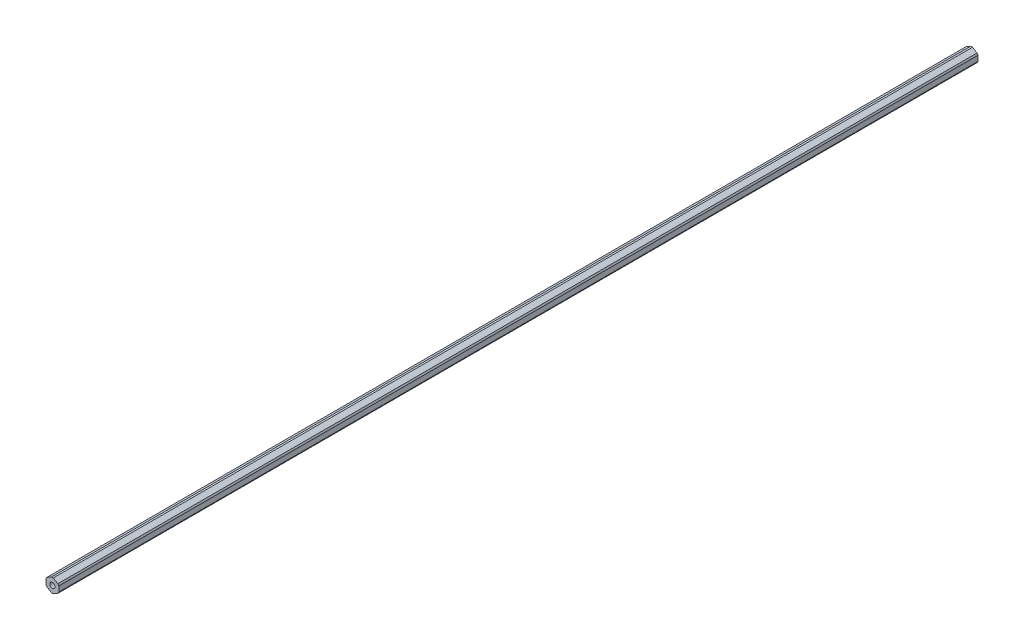
ISO-10303-21;
HEADER;
FILE_DESCRIPTION(('STEP AP214'),'2;1');
FILE_NAME('part.step','',(''),(''),'','','');
FILE_SCHEMA(('AUTOMOTIVE_DESIGN { 1 0 10303 214 1 1 1 1 }'));
ENDSEC;
DATA;
#1=APPLICATION_CONTEXT('core data for automotive mechanical design processes');
#2=APPLICATION_PROTOCOL_DEFINITION('international standard','automotive_design',2000,#1);
#3=PRODUCT_CONTEXT('',#1,'mechanical');
#4=PRODUCT('Part','Part','',(#3));
#5=PRODUCT_RELATED_PRODUCT_CATEGORY('part','',(#4));
#6=PRODUCT_DEFINITION_FORMATION('','',#4);
#7=PRODUCT_DEFINITION_CONTEXT('part definition',#1,'design');
#8=PRODUCT_DEFINITION('design','',#6,#7);
#9=PRODUCT_DEFINITION_SHAPE('','',#8);
#10=(LENGTH_UNIT() NAMED_UNIT(*) SI_UNIT(.MILLI.,.METRE.));
#11=(NAMED_UNIT(*) PLANE_ANGLE_UNIT() SI_UNIT($,.RADIAN.));
#12=(NAMED_UNIT(*) SI_UNIT($,.STERADIAN.) SOLID_ANGLE_UNIT());
#13=UNCERTAINTY_MEASURE_WITH_UNIT(LENGTH_MEASURE(1.E-05),#10,'distance_accuracy_value','');
#14=(GEOMETRIC_REPRESENTATION_CONTEXT(3) GLOBAL_UNCERTAINTY_ASSIGNED_CONTEXT((#13)) GLOBAL_UNIT_ASSIGNED_CONTEXT((#10,
#11,#12)) REPRESENTATION_CONTEXT('',''));
#15=CARTESIAN_POINT('',(0.,0.,0.));
#16=DIRECTION('',(0.,0.,1.));
#17=DIRECTION('',(1.,0.,0.));
#18=AXIS2_PLACEMENT_3D('',#15,#16,#17);
#19=CARTESIAN_POINT('',(6.35,3.66617420935413,914.4));
#20=DIRECTION('',(-0.5,-0.866025403784439,0.));
#21=DIRECTION('',(0.866025403784439,-0.5,0.));
#22=AXIS2_PLACEMENT_3D('',#19,#20,#21);
#23=PLANE('',#22);
#24=DIRECTION('',(0.,0.,-1.));
#25=VECTOR('',#24,1.);
#26=CARTESIAN_POINT('',(0.888411377865496,6.81942387054648,914.4));
#27=LINE('',#26,#25);
#28=CARTESIAN_POINT('',(0.88841137786549,6.81942387054648,914.4));
#29=VERTEX_POINT('',#28);
#30=CARTESIAN_POINT('',(0.88841137786549,6.81942387054648,0.));
#31=VERTEX_POINT('',#30);
#32=EDGE_CURVE('E161',#29,#31,#27,.T.);
#33=ORIENTED_EDGE('',*,*,#32,.F.);
#34=DIRECTION('',(-0.866025403784439,0.5,0.));
#35=VECTOR('',#34,1.);
#36=CARTESIAN_POINT('',(6.35,3.66617420935413,914.4));
#37=LINE('',#36,#35);
#38=CARTESIAN_POINT('',(5.46158862213451,4.17909875751589,914.4));
#39=VERTEX_POINT('',#38);
#40=EDGE_CURVE('E149',#39,#29,#37,.T.);
#41=ORIENTED_EDGE('',*,*,#40,.F.);
#42=DIRECTION('',(0.,0.,-1.));
#43=VECTOR('',#42,1.);
#44=CARTESIAN_POINT('',(5.46158862213451,4.1790987575159,914.4));
#45=LINE('',#44,#43);
#46=CARTESIAN_POINT('',(5.46158862213451,4.17909875751589,0.));
#47=VERTEX_POINT('',#46);
#48=EDGE_CURVE('E182',#47,#39,#45,.F.);
#49=ORIENTED_EDGE('',*,*,#48,.F.);
#50=DIRECTION('',(-0.866025403784439,0.5,0.));
#51=VECTOR('',#50,1.);
#52=CARTESIAN_POINT('',(6.35,3.66617420935413,0.));
#53=LINE('',#52,#51);
#54=EDGE_CURVE('E157',#47,#31,#53,.T.);
#55=ORIENTED_EDGE('',*,*,#54,.T.);
#56=EDGE_LOOP('',(#33,#41,#49,#55));
#57=FACE_BOUND('',#56,.T.);
#58=ADVANCED_FACE('F32',(#57),#23,.F.);
#59=CARTESIAN_POINT('',(0.,7.33234841870825,914.4));
#60=DIRECTION('',(0.5,-0.866025403784439,0.));
#61=DIRECTION('',(0.866025403784439,0.5,0.));
#62=AXIS2_PLACEMENT_3D('',#59,#60,#61);
#63=PLANE('',#62);
#64=DIRECTION('',(0.,0.,-1.));
#65=VECTOR('',#64,1.);
#66=CARTESIAN_POINT('',(-5.4615886221345,4.1790987575159,914.4));
#67=LINE('',#66,#65);
#68=CARTESIAN_POINT('',(-5.46158862213451,4.17909875751589,914.4));
#69=VERTEX_POINT('',#68);
#70=CARTESIAN_POINT('',(-5.46158862213451,4.17909875751589,0.));
#71=VERTEX_POINT('',#70);
#72=EDGE_CURVE('E47',#69,#71,#67,.T.);
#73=ORIENTED_EDGE('',*,*,#72,.F.);
#74=DIRECTION('',(-0.866025403784439,-0.5,0.));
#75=VECTOR('',#74,1.);
#76=CARTESIAN_POINT('',(0.,7.33234841870825,914.4));
#77=LINE('',#76,#75);
#78=CARTESIAN_POINT('',(-0.888411377865489,6.81942387054648,914.4));
#79=VERTEX_POINT('',#78);
#80=EDGE_CURVE('E138',#79,#69,#77,.T.);
#81=ORIENTED_EDGE('',*,*,#80,.F.);
#82=DIRECTION('',(0.,0.,-1.));
#83=VECTOR('',#82,1.);
#84=CARTESIAN_POINT('',(-0.888411377865495,6.81942387054648,914.4));
#85=LINE('',#84,#83);
#86=CARTESIAN_POINT('',(-0.888411377865489,6.81942387054648,0.));
#87=VERTEX_POINT('',#86);
#88=EDGE_CURVE('E185',#87,#79,#85,.F.);
#89=ORIENTED_EDGE('',*,*,#88,.F.);
#90=DIRECTION('',(-0.866025403784439,-0.5,0.));
#91=VECTOR('',#90,1.);
#92=CARTESIAN_POINT('',(0.,7.33234841870825,0.));
#93=LINE('',#92,#91);
#94=EDGE_CURVE('E160',#87,#71,#93,.T.);
#95=ORIENTED_EDGE('',*,*,#94,.T.);
#96=EDGE_LOOP('',(#73,#81,#89,#95));
#97=FACE_BOUND('',#96,.T.);
#98=ADVANCED_FACE('F266',(#97),#63,.F.);
#99=CARTESIAN_POINT('',(-6.35,3.66617420935412,914.4));
#100=DIRECTION('',(1.,0.,0.));
#101=DIRECTION('',(0.,0.,-1.));
#102=AXIS2_PLACEMENT_3D('',#99,#100,#101);
#103=PLANE('',#102);
#104=DIRECTION('',(0.,0.,-1.));
#105=VECTOR('',#104,1.);
#106=CARTESIAN_POINT('',(-6.35,-2.64032511303059,914.4));
#107=LINE('',#106,#105);
#108=CARTESIAN_POINT('',(-6.35,-2.64032511303059,914.4));
#109=VERTEX_POINT('',#108);
#110=CARTESIAN_POINT('',(-6.35,-2.64032511303059,0.));
#111=VERTEX_POINT('',#110);
#112=EDGE_CURVE('E55',#109,#111,#107,.T.);
#113=ORIENTED_EDGE('',*,*,#112,.F.);
#114=DIRECTION('',(0.,-1.,0.));
#115=VECTOR('',#114,1.);
#116=CARTESIAN_POINT('',(-6.35,3.66617420935412,914.4));
#117=LINE('',#116,#115);
#118=CARTESIAN_POINT('',(-6.35,2.64032511303059,914.4));
#119=VERTEX_POINT('',#118);
#120=EDGE_CURVE('E135',#119,#109,#117,.T.);
#121=ORIENTED_EDGE('',*,*,#120,.F.);
#122=DIRECTION('',(0.,0.,-1.));
#123=VECTOR('',#122,1.);
#124=CARTESIAN_POINT('',(-6.35,2.64032511303059,914.4));
#125=LINE('',#124,#123);
#126=CARTESIAN_POINT('',(-6.35,2.64032511303059,0.));
#127=VERTEX_POINT('',#126);
#128=EDGE_CURVE('E118',#127,#119,#125,.F.);
#129=ORIENTED_EDGE('',*,*,#128,.F.);
#130=DIRECTION('',(0.,-1.,0.));
#131=VECTOR('',#130,1.);
#132=CARTESIAN_POINT('',(-6.35,3.66617420935412,0.));
#133=LINE('',#132,#131);
#134=EDGE_CURVE('E164',#127,#111,#133,.T.);
#135=ORIENTED_EDGE('',*,*,#134,.T.);
#136=EDGE_LOOP('',(#113,#121,#129,#135));
#137=FACE_BOUND('',#136,.T.);
#138=ADVANCED_FACE('F143',(#137),#103,.F.);
#139=CARTESIAN_POINT('',(-6.35,-3.66617420935412,914.4));
#140=DIRECTION('',(0.5,0.866025403784439,0.));
#141=DIRECTION('',(-0.866025403784438,0.5,0.));
#142=AXIS2_PLACEMENT_3D('',#139,#140,#141);
#143=PLANE('',#142);
#144=DIRECTION('',(0.,0.,-1.));
#145=VECTOR('',#144,1.);
#146=CARTESIAN_POINT('',(-0.888411377865498,-6.81942387054648,914.4));
#147=LINE('',#146,#145);
#148=CARTESIAN_POINT('',(-0.888411377865492,-6.81942387054648,914.4));
#149=VERTEX_POINT('',#148);
#150=CARTESIAN_POINT('',(-0.888411377865492,-6.81942387054648,0.));
#151=VERTEX_POINT('',#150);
#152=EDGE_CURVE('E127',#149,#151,#147,.T.);
#153=ORIENTED_EDGE('',*,*,#152,.F.);
#154=DIRECTION('',(0.866025403784438,-0.5,0.));
#155=VECTOR('',#154,1.);
#156=CARTESIAN_POINT('',(-6.35,-3.66617420935412,914.4));
#157=LINE('',#156,#155);
#158=CARTESIAN_POINT('',(-5.46158862213451,-4.17909875751589,914.4));
#159=VERTEX_POINT('',#158);
#160=EDGE_CURVE('E144',#159,#149,#157,.T.);
#161=ORIENTED_EDGE('',*,*,#160,.F.);
#162=DIRECTION('',(0.,0.,-1.));
#163=VECTOR('',#162,1.);
#164=CARTESIAN_POINT('',(-5.46158862213451,-4.1790987575159,914.4));
#165=LINE('',#164,#163);
#166=CARTESIAN_POINT('',(-5.46158862213451,-4.17909875751589,0.));
#167=VERTEX_POINT('',#166);
#168=EDGE_CURVE('E189',#167,#159,#165,.F.);
#169=ORIENTED_EDGE('',*,*,#168,.F.);
#170=DIRECTION('',(0.866025403784438,-0.5,0.));
#171=VECTOR('',#170,1.);
#172=CARTESIAN_POINT('',(-6.35,-3.66617420935412,0.));
#173=LINE('',#172,#171);
#174=EDGE_CURVE('E166',#167,#151,#173,.T.);
#175=ORIENTED_EDGE('',*,*,#174,.T.);
#176=EDGE_LOOP('',(#153,#161,#169,#175));
#177=FACE_BOUND('',#176,.T.);
#178=ADVANCED_FACE('F252',(#177),#143,.F.);
#179=CARTESIAN_POINT('',(0.,-7.33234841870825,914.4));
#180=DIRECTION('',(-0.5,0.866025403784439,0.));
#181=DIRECTION('',(-0.866025403784439,-0.5,0.));
#182=AXIS2_PLACEMENT_3D('',#179,#180,#181);
#183=PLANE('',#182);
#184=DIRECTION('',(0.,0.,-1.));
#185=VECTOR('',#184,1.);
#186=CARTESIAN_POINT('',(5.46158862213451,-4.17909875751589,914.4));
#187=LINE('',#186,#185);
#188=CARTESIAN_POINT('',(5.46158862213451,-4.17909875751589,914.4));
#189=VERTEX_POINT('',#188);
#190=CARTESIAN_POINT('',(5.46158862213451,-4.17909875751589,0.));
#191=VERTEX_POINT('',#190);
#192=EDGE_CURVE('E191',#189,#191,#187,.T.);
#193=ORIENTED_EDGE('',*,*,#192,.F.);
#194=DIRECTION('',(0.866025403784439,0.5,0.));
#195=VECTOR('',#194,1.);
#196=CARTESIAN_POINT('',(0.,-7.33234841870825,914.4));
#197=LINE('',#196,#195);
#198=CARTESIAN_POINT('',(0.88841137786549,-6.81942387054648,914.4));
#199=VERTEX_POINT('',#198);
#200=EDGE_CURVE('E147',#199,#189,#197,.T.);
#201=ORIENTED_EDGE('',*,*,#200,.F.);
#202=DIRECTION('',(0.,0.,-1.));
#203=VECTOR('',#202,1.);
#204=CARTESIAN_POINT('',(0.888411377865486,-6.81942387054648,914.4));
#205=LINE('',#204,#203);
#206=CARTESIAN_POINT('',(0.88841137786549,-6.81942387054648,0.));
#207=VERTEX_POINT('',#206);
#208=EDGE_CURVE('E193',#207,#199,#205,.F.);
#209=ORIENTED_EDGE('',*,*,#208,.F.);
#210=DIRECTION('',(0.866025403784439,0.5,0.));
#211=VECTOR('',#210,1.);
#212=CARTESIAN_POINT('',(0.,-7.33234841870825,0.));
#213=LINE('',#212,#211);
#214=EDGE_CURVE('E169',#207,#191,#213,.T.);
#215=ORIENTED_EDGE('',*,*,#214,.T.);
#216=EDGE_LOOP('',(#193,#201,#209,#215));
#217=FACE_BOUND('',#216,.T.);
#218=ADVANCED_FACE('F256',(#217),#183,.F.);
#219=CARTESIAN_POINT('',(6.35,-3.66617420935413,914.4));
#220=DIRECTION('',(-1.,0.,0.));
#221=DIRECTION('',(0.,-1.,0.));
#222=AXIS2_PLACEMENT_3D('',#219,#220,#221);
#223=PLANE('',#222);
#224=DIRECTION('',(0.,0.,-1.));
#225=VECTOR('',#224,1.);
#226=CARTESIAN_POINT('',(6.35,2.6403251130306,914.4));
#227=LINE('',#226,#225);
#228=CARTESIAN_POINT('',(6.35,2.6403251130306,914.4));
#229=VERTEX_POINT('',#228);
#230=CARTESIAN_POINT('',(6.35,2.6403251130306,0.));
#231=VERTEX_POINT('',#230);
#232=EDGE_CURVE('E195',#229,#231,#227,.T.);
#233=ORIENTED_EDGE('',*,*,#232,.F.);
#234=DIRECTION('',(0.,1.,0.));
#235=VECTOR('',#234,1.);
#236=CARTESIAN_POINT('',(6.35,-3.66617420935413,914.4));
#237=LINE('',#236,#235);
#238=CARTESIAN_POINT('',(6.35,-2.64032511303059,914.4));
#239=VERTEX_POINT('',#238);
#240=EDGE_CURVE('E155',#239,#229,#237,.T.);
#241=ORIENTED_EDGE('',*,*,#240,.F.);
#242=DIRECTION('',(0.,0.,-1.));
#243=VECTOR('',#242,1.);
#244=CARTESIAN_POINT('',(6.35,-2.64032511303059,914.4));
#245=LINE('',#244,#243);
#246=CARTESIAN_POINT('',(6.35,-2.64032511303059,0.));
#247=VERTEX_POINT('',#246);
#248=EDGE_CURVE('E139',#247,#239,#245,.F.);
#249=ORIENTED_EDGE('',*,*,#248,.F.);
#250=DIRECTION('',(0.,1.,0.));
#251=VECTOR('',#250,1.);
#252=CARTESIAN_POINT('',(6.35,-3.66617420935413,0.));
#253=LINE('',#252,#251);
#254=EDGE_CURVE('E171',#247,#231,#253,.T.);
#255=ORIENTED_EDGE('',*,*,#254,.T.);
#256=EDGE_LOOP('',(#233,#241,#249,#255));
#257=FACE_BOUND('',#256,.T.);
#258=ADVANCED_FACE('F242',(#257),#223,.F.);
#259=CARTESIAN_POINT('',(0.,0.,914.4));
#260=DIRECTION('',(0.,0.,1.));
#261=DIRECTION('',(1.,0.,0.));
#262=AXIS2_PLACEMENT_3D('',#259,#260,#261);
#263=PLANE('',#262);
#264=CARTESIAN_POINT('',(0.,0.,914.4));
#265=DIRECTION('',(0.,0.,-1.));
#266=DIRECTION('',(-1.,0.,0.));
#267=AXIS2_PLACEMENT_3D('',#264,#265,#266);
#268=CIRCLE('',#267,2.5527);
#269=CARTESIAN_POINT('',(-2.5527,0.,914.4));
#270=VERTEX_POINT('',#269);
#271=EDGE_CURVE('E198',#270,#270,#268,.T.);
#272=ORIENTED_EDGE('',*,*,#271,.T.);
#273=EDGE_LOOP('',(#272));
#274=FACE_BOUND('',#273,.T.);
#275=ORIENTED_EDGE('',*,*,#240,.T.);
#276=CARTESIAN_POINT('',(0.,0.,914.4));
#277=DIRECTION('',(0.,0.,-1.));
#278=DIRECTION('',(-1.,0.,0.));
#279=AXIS2_PLACEMENT_3D('',#276,#277,#278);
#280=CIRCLE('',#279,6.87705);
#281=EDGE_CURVE('E243',#39,#229,#280,.T.);
#282=ORIENTED_EDGE('',*,*,#281,.F.);
#283=ORIENTED_EDGE('',*,*,#40,.T.);
#284=EDGE_CURVE('E140',#79,#29,#280,.T.);
#285=ORIENTED_EDGE('',*,*,#284,.F.);
#286=ORIENTED_EDGE('',*,*,#80,.T.);
#287=EDGE_CURVE('E121',#119,#69,#280,.T.);
#288=ORIENTED_EDGE('',*,*,#287,.F.);
#289=ORIENTED_EDGE('',*,*,#120,.T.);
#290=EDGE_CURVE('E142',#159,#109,#280,.T.);
#291=ORIENTED_EDGE('',*,*,#290,.F.);
#292=ORIENTED_EDGE('',*,*,#160,.T.);
#293=EDGE_CURVE('E247',#199,#149,#280,.T.);
#294=ORIENTED_EDGE('',*,*,#293,.F.);
#295=ORIENTED_EDGE('',*,*,#200,.T.);
#296=EDGE_CURVE('E244',#239,#189,#280,.T.);
#297=ORIENTED_EDGE('',*,*,#296,.F.);
#298=EDGE_LOOP('',(#275,#282,#283,#285,#286,#288,#289,#291,#292,#294,#295,#297));
#299=FACE_BOUND('',#298,.T.);
#300=ADVANCED_FACE('F133',(#274,#299),#263,.T.);
#301=CARTESIAN_POINT('',(0.,0.,0.));
#302=DIRECTION('',(0.,0.,1.));
#303=DIRECTION('',(1.,0.,0.));
#304=AXIS2_PLACEMENT_3D('',#301,#302,#303);
#305=PLANE('',#304);
#306=CARTESIAN_POINT('',(0.,0.,0.));
#307=DIRECTION('',(0.,0.,-1.));
#308=DIRECTION('',(-1.,0.,0.));
#309=AXIS2_PLACEMENT_3D('',#306,#307,#308);
#310=CIRCLE('',#309,2.5527);
#311=CARTESIAN_POINT('',(-2.5527,0.,0.));
#312=VERTEX_POINT('',#311);
#313=EDGE_CURVE('E200',#312,#312,#310,.T.);
#314=ORIENTED_EDGE('',*,*,#313,.F.);
#315=EDGE_LOOP('',(#314));
#316=FACE_BOUND('',#315,.T.);
#317=CARTESIAN_POINT('',(0.,0.,0.));
#318=DIRECTION('',(0.,0.,1.));
#319=DIRECTION('',(1.,0.,0.));
#320=AXIS2_PLACEMENT_3D('',#317,#318,#319);
#321=CIRCLE('',#320,6.87705);
#322=EDGE_CURVE('E11',#231,#47,#321,.T.);
#323=ORIENTED_EDGE('',*,*,#322,.F.);
#324=ORIENTED_EDGE('',*,*,#254,.F.);
#325=EDGE_CURVE('E35',#191,#247,#321,.T.);
#326=ORIENTED_EDGE('',*,*,#325,.F.);
#327=ORIENTED_EDGE('',*,*,#214,.F.);
#328=EDGE_CURVE('E232',#151,#207,#321,.T.);
#329=ORIENTED_EDGE('',*,*,#328,.F.);
#330=ORIENTED_EDGE('',*,*,#174,.F.);
#331=EDGE_CURVE('E231',#111,#167,#321,.T.);
#332=ORIENTED_EDGE('',*,*,#331,.F.);
#333=ORIENTED_EDGE('',*,*,#134,.F.);
#334=CARTESIAN_POINT('',(0.,0.,0.));
#335=DIRECTION('',(0.,0.,-1.));
#336=DIRECTION('',(-1.,0.,0.));
#337=AXIS2_PLACEMENT_3D('',#334,#335,#336);
#338=CIRCLE('',#337,6.87705);
#339=EDGE_CURVE('E122',#127,#71,#338,.T.);
#340=ORIENTED_EDGE('',*,*,#339,.T.);
#341=ORIENTED_EDGE('',*,*,#94,.F.);
#342=EDGE_CURVE('E40',#31,#87,#321,.T.);
#343=ORIENTED_EDGE('',*,*,#342,.F.);
#344=ORIENTED_EDGE('',*,*,#54,.F.);
#345=EDGE_LOOP('',(#323,#324,#326,#327,#329,#330,#332,#333,#340,#341,#343,#344));
#346=FACE_BOUND('',#345,.T.);
#347=ADVANCED_FACE('F214',(#316,#346),#305,.F.);
#348=CARTESIAN_POINT('',(0.,0.,914.4));
#349=DIRECTION('',(0.,0.,-1.));
#350=DIRECTION('',(-1.,0.,0.));
#351=AXIS2_PLACEMENT_3D('',#348,#349,#350);
#352=CYLINDRICAL_SURFACE('',#351,6.87705);
#353=ORIENTED_EDGE('',*,*,#192,.T.);
#354=ORIENTED_EDGE('',*,*,#325,.T.);
#355=ORIENTED_EDGE('',*,*,#248,.T.);
#356=ORIENTED_EDGE('',*,*,#296,.T.);
#357=EDGE_LOOP('',(#353,#354,#355,#356));
#358=FACE_BOUND('',#357,.T.);
#359=ADVANCED_FACE('F217',(#358),#352,.T.);
#360=ORIENTED_EDGE('',*,*,#152,.T.);
#361=ORIENTED_EDGE('',*,*,#328,.T.);
#362=ORIENTED_EDGE('',*,*,#208,.T.);
#363=ORIENTED_EDGE('',*,*,#293,.T.);
#364=EDGE_LOOP('',(#360,#361,#362,#363));
#365=FACE_BOUND('',#364,.T.);
#366=ADVANCED_FACE('F254',(#365),#352,.T.);
#367=ORIENTED_EDGE('',*,*,#112,.T.);
#368=ORIENTED_EDGE('',*,*,#331,.T.);
#369=ORIENTED_EDGE('',*,*,#168,.T.);
#370=ORIENTED_EDGE('',*,*,#290,.T.);
#371=EDGE_LOOP('',(#367,#368,#369,#370));
#372=FACE_BOUND('',#371,.T.);
#373=ADVANCED_FACE('F249',(#372),#352,.T.);
#374=ORIENTED_EDGE('',*,*,#72,.T.);
#375=ORIENTED_EDGE('',*,*,#339,.F.);
#376=ORIENTED_EDGE('',*,*,#128,.T.);
#377=ORIENTED_EDGE('',*,*,#287,.T.);
#378=EDGE_LOOP('',(#374,#375,#376,#377));
#379=FACE_BOUND('',#378,.T.);
#380=ADVANCED_FACE('F120',(#379),#352,.T.);
#381=ORIENTED_EDGE('',*,*,#32,.T.);
#382=ORIENTED_EDGE('',*,*,#342,.T.);
#383=ORIENTED_EDGE('',*,*,#88,.T.);
#384=ORIENTED_EDGE('',*,*,#284,.T.);
#385=EDGE_LOOP('',(#381,#382,#383,#384));
#386=FACE_BOUND('',#385,.T.);
#387=ADVANCED_FACE('F228',(#386),#352,.T.);
#388=ORIENTED_EDGE('',*,*,#48,.T.);
#389=ORIENTED_EDGE('',*,*,#281,.T.);
#390=ORIENTED_EDGE('',*,*,#232,.T.);
#391=ORIENTED_EDGE('',*,*,#322,.T.);
#392=EDGE_LOOP('',(#388,#389,#390,#391));
#393=FACE_BOUND('',#392,.T.);
#394=ADVANCED_FACE('F210',(#393),#352,.T.);
#395=CARTESIAN_POINT('',(0.,0.,914.4));
#396=DIRECTION('',(0.,0.,-1.));
#397=DIRECTION('',(-1.,0.,0.));
#398=AXIS2_PLACEMENT_3D('',#395,#396,#397);
#399=CYLINDRICAL_SURFACE('',#398,2.5527);
#400=ORIENTED_EDGE('',*,*,#271,.F.);
#401=EDGE_LOOP('',(#400));
#402=FACE_BOUND('',#401,.T.);
#403=ORIENTED_EDGE('',*,*,#313,.T.);
#404=EDGE_LOOP('',(#403));
#405=FACE_BOUND('',#404,.T.);
#406=ADVANCED_FACE('F207',(#402,#405),#399,.F.);
#407=CLOSED_SHELL('',(#58,#98,#138,#178,#218,#258,#300,#347,#359,#366,#373,#380,#387,#394,#406));
#408=MANIFOLD_SOLID_BREP('B2',#407);
#409=ADVANCED_BREP_SHAPE_REPRESENTATION('',(#18,#408),#14);
#410=SHAPE_DEFINITION_REPRESENTATION(#9,#409);
ENDSEC;
END-ISO-10303-21;
